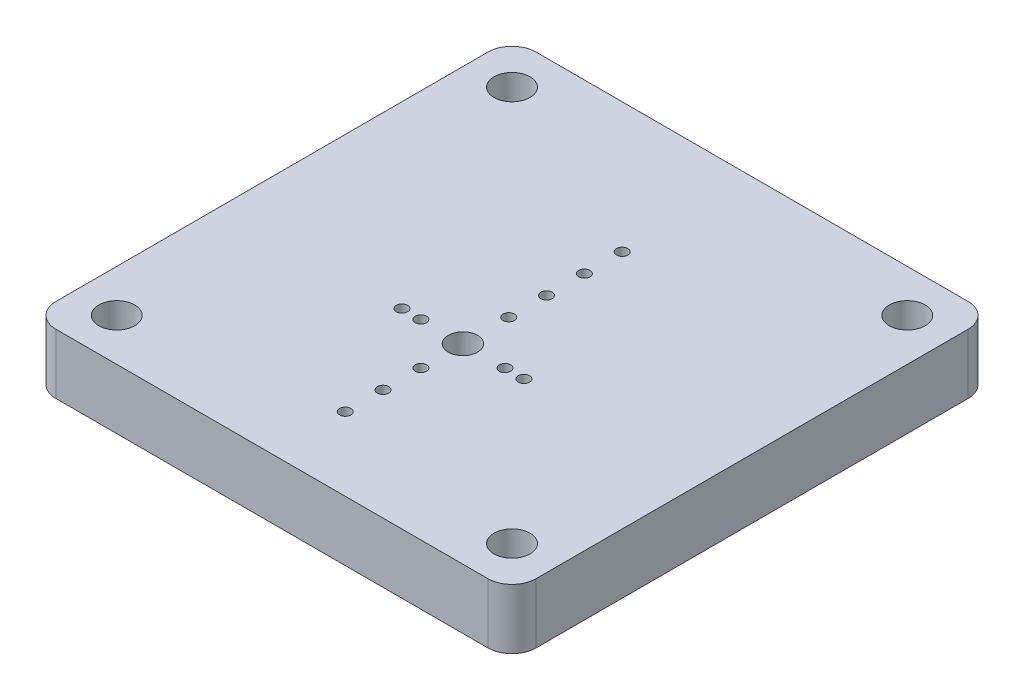
ISO-10303-21;
HEADER;
FILE_DESCRIPTION(('STEP AP214'),'2;1');
FILE_NAME('part.step','',(''),(''),'','','');
FILE_SCHEMA(('AUTOMOTIVE_DESIGN { 1 0 10303 214 1 1 1 1 }'));
ENDSEC;
DATA;
#1=APPLICATION_CONTEXT('core data for automotive mechanical design processes');
#2=APPLICATION_PROTOCOL_DEFINITION('international standard','automotive_design',2000,#1);
#3=PRODUCT_CONTEXT('',#1,'mechanical');
#4=PRODUCT('Part','Part','',(#3));
#5=PRODUCT_RELATED_PRODUCT_CATEGORY('part','',(#4));
#6=PRODUCT_DEFINITION_FORMATION('','',#4);
#7=PRODUCT_DEFINITION_CONTEXT('part definition',#1,'design');
#8=PRODUCT_DEFINITION('design','',#6,#7);
#9=PRODUCT_DEFINITION_SHAPE('','',#8);
#10=(LENGTH_UNIT() NAMED_UNIT(*) SI_UNIT(.MILLI.,.METRE.));
#11=(NAMED_UNIT(*) PLANE_ANGLE_UNIT() SI_UNIT($,.RADIAN.));
#12=(NAMED_UNIT(*) SI_UNIT($,.STERADIAN.) SOLID_ANGLE_UNIT());
#13=UNCERTAINTY_MEASURE_WITH_UNIT(LENGTH_MEASURE(1.E-05),#10,'distance_accuracy_value','');
#14=(GEOMETRIC_REPRESENTATION_CONTEXT(3) GLOBAL_UNCERTAINTY_ASSIGNED_CONTEXT((#13)) GLOBAL_UNIT_ASSIGNED_CONTEXT((#10,
#11,#12)) REPRESENTATION_CONTEXT('',''));
#15=CARTESIAN_POINT('',(0.,0.,0.));
#16=DIRECTION('',(0.,0.,1.));
#17=DIRECTION('',(1.,0.,0.));
#18=AXIS2_PLACEMENT_3D('',#15,#16,#17);
#19=CARTESIAN_POINT('',(25.404,6.35,-11.752));
#20=DIRECTION('',(0.,-1.,0.));
#21=DIRECTION('',(0.,0.,-1.));
#22=AXIS2_PLACEMENT_3D('',#19,#20,#21);
#23=CYLINDRICAL_SURFACE('',#22,0.600000000000017);
#24=CARTESIAN_POINT('',(25.404,6.35,-11.752));
#25=DIRECTION('',(0.,1.,0.));
#26=DIRECTION('',(0.,0.,1.));
#27=AXIS2_PLACEMENT_3D('',#24,#25,#26);
#28=CIRCLE('',#27,0.600000000000017);
#29=CARTESIAN_POINT('',(25.404,6.35,-11.152));
#30=VERTEX_POINT('',#29);
#31=EDGE_CURVE('E297',#30,#30,#28,.T.);
#32=ORIENTED_EDGE('',*,*,#31,.T.);
#33=EDGE_LOOP('',(#32));
#34=FACE_BOUND('',#33,.T.);
#35=CARTESIAN_POINT('',(25.404,3.175,-11.752));
#36=DIRECTION('',(0.,-1.,0.));
#37=DIRECTION('',(0.,0.,-1.));
#38=AXIS2_PLACEMENT_3D('',#35,#36,#37);
#39=CIRCLE('',#38,0.600000000000017);
#40=CARTESIAN_POINT('',(25.404,3.175,-12.352));
#41=VERTEX_POINT('',#40);
#42=EDGE_CURVE('E256',#41,#41,#39,.T.);
#43=ORIENTED_EDGE('',*,*,#42,.T.);
#44=EDGE_LOOP('',(#43));
#45=FACE_BOUND('',#44,.T.);
#46=ADVANCED_FACE('F41',(#34,#45),#23,.F.);
#47=CARTESIAN_POINT('',(18.954,6.35,-20.202));
#48=DIRECTION('',(0.,-1.,0.));
#49=DIRECTION('',(0.,0.,-1.));
#50=AXIS2_PLACEMENT_3D('',#47,#48,#49);
#51=CYLINDRICAL_SURFACE('',#50,0.600000000000021);
#52=CARTESIAN_POINT('',(18.954,6.35,-20.202));
#53=DIRECTION('',(0.,1.,0.));
#54=DIRECTION('',(0.,0.,1.));
#55=AXIS2_PLACEMENT_3D('',#52,#53,#54);
#56=CIRCLE('',#55,0.600000000000021);
#57=CARTESIAN_POINT('',(18.954,6.35,-19.602));
#58=VERTEX_POINT('',#57);
#59=EDGE_CURVE('E294',#58,#58,#56,.T.);
#60=ORIENTED_EDGE('',*,*,#59,.T.);
#61=EDGE_LOOP('',(#60));
#62=FACE_BOUND('',#61,.T.);
#63=CARTESIAN_POINT('',(18.954,3.175,-20.202));
#64=DIRECTION('',(0.,-1.,0.));
#65=DIRECTION('',(0.,0.,-1.));
#66=AXIS2_PLACEMENT_3D('',#63,#64,#65);
#67=CIRCLE('',#66,0.600000000000021);
#68=CARTESIAN_POINT('',(18.954,3.175,-20.802));
#69=VERTEX_POINT('',#68);
#70=EDGE_CURVE('E253',#69,#69,#67,.T.);
#71=ORIENTED_EDGE('',*,*,#70,.T.);
#72=EDGE_LOOP('',(#71));
#73=FACE_BOUND('',#72,.T.);
#74=ADVANCED_FACE('F418',(#62,#73),#51,.F.);
#75=CARTESIAN_POINT('',(20.954,6.35,-20.202));
#76=DIRECTION('',(0.,-1.,0.));
#77=DIRECTION('',(0.,0.,-1.));
#78=AXIS2_PLACEMENT_3D('',#75,#76,#77);
#79=CYLINDRICAL_SURFACE('',#78,0.600000000000017);
#80=CARTESIAN_POINT('',(20.954,6.35,-20.202));
#81=DIRECTION('',(0.,1.,0.));
#82=DIRECTION('',(0.,0.,1.));
#83=AXIS2_PLACEMENT_3D('',#80,#81,#82);
#84=CIRCLE('',#83,0.600000000000017);
#85=CARTESIAN_POINT('',(20.954,6.35,-19.602));
#86=VERTEX_POINT('',#85);
#87=EDGE_CURVE('E291',#86,#86,#84,.T.);
#88=ORIENTED_EDGE('',*,*,#87,.T.);
#89=EDGE_LOOP('',(#88));
#90=FACE_BOUND('',#89,.T.);
#91=CARTESIAN_POINT('',(20.954,3.175,-20.202));
#92=DIRECTION('',(0.,-1.,0.));
#93=DIRECTION('',(0.,0.,-1.));
#94=AXIS2_PLACEMENT_3D('',#91,#92,#93);
#95=CIRCLE('',#94,0.600000000000017);
#96=CARTESIAN_POINT('',(20.954,3.175,-20.802));
#97=VERTEX_POINT('',#96);
#98=EDGE_CURVE('E250',#97,#97,#95,.T.);
#99=ORIENTED_EDGE('',*,*,#98,.T.);
#100=EDGE_LOOP('',(#99));
#101=FACE_BOUND('',#100,.T.);
#102=ADVANCED_FACE('F424',(#90,#101),#79,.F.);
#103=CARTESIAN_POINT('',(31.854,6.35,-20.202));
#104=DIRECTION('',(0.,-1.,0.));
#105=DIRECTION('',(0.,0.,-1.));
#106=AXIS2_PLACEMENT_3D('',#103,#104,#105);
#107=CYLINDRICAL_SURFACE('',#106,0.60000000000001);
#108=CARTESIAN_POINT('',(31.854,6.35,-20.202));
#109=DIRECTION('',(0.,1.,0.));
#110=DIRECTION('',(0.,0.,1.));
#111=AXIS2_PLACEMENT_3D('',#108,#109,#110);
#112=CIRCLE('',#111,0.60000000000001);
#113=CARTESIAN_POINT('',(31.854,6.35,-19.602));
#114=VERTEX_POINT('',#113);
#115=EDGE_CURVE('E288',#114,#114,#112,.T.);
#116=ORIENTED_EDGE('',*,*,#115,.T.);
#117=EDGE_LOOP('',(#116));
#118=FACE_BOUND('',#117,.T.);
#119=CARTESIAN_POINT('',(31.854,3.175,-20.202));
#120=DIRECTION('',(0.,-1.,0.));
#121=DIRECTION('',(0.,0.,-1.));
#122=AXIS2_PLACEMENT_3D('',#119,#120,#121);
#123=CIRCLE('',#122,0.60000000000001);
#124=CARTESIAN_POINT('',(31.854,3.175,-20.802));
#125=VERTEX_POINT('',#124);
#126=EDGE_CURVE('E247',#125,#125,#123,.T.);
#127=ORIENTED_EDGE('',*,*,#126,.T.);
#128=EDGE_LOOP('',(#127));
#129=FACE_BOUND('',#128,.T.);
#130=ADVANCED_FACE('F434',(#118,#129),#107,.F.);
#131=CARTESIAN_POINT('',(29.854,6.35,-20.202));
#132=DIRECTION('',(0.,-1.,0.));
#133=DIRECTION('',(0.,0.,-1.));
#134=AXIS2_PLACEMENT_3D('',#131,#132,#133);
#135=CYLINDRICAL_SURFACE('',#134,0.600000000000017);
#136=CARTESIAN_POINT('',(29.854,6.35,-20.202));
#137=DIRECTION('',(0.,1.,0.));
#138=DIRECTION('',(0.,0.,1.));
#139=AXIS2_PLACEMENT_3D('',#136,#137,#138);
#140=CIRCLE('',#139,0.600000000000017);
#141=CARTESIAN_POINT('',(29.854,6.35,-19.602));
#142=VERTEX_POINT('',#141);
#143=EDGE_CURVE('E285',#142,#142,#140,.T.);
#144=ORIENTED_EDGE('',*,*,#143,.T.);
#145=EDGE_LOOP('',(#144));
#146=FACE_BOUND('',#145,.T.);
#147=CARTESIAN_POINT('',(29.854,3.175,-20.202));
#148=DIRECTION('',(0.,-1.,0.));
#149=DIRECTION('',(0.,0.,-1.));
#150=AXIS2_PLACEMENT_3D('',#147,#148,#149);
#151=CIRCLE('',#150,0.600000000000017);
#152=CARTESIAN_POINT('',(29.854,3.175,-20.802));
#153=VERTEX_POINT('',#152);
#154=EDGE_CURVE('E244',#153,#153,#151,.T.);
#155=ORIENTED_EDGE('',*,*,#154,.T.);
#156=EDGE_LOOP('',(#155));
#157=FACE_BOUND('',#156,.T.);
#158=ADVANCED_FACE('F438',(#146,#157),#135,.F.);
#159=CARTESIAN_POINT('',(25.404,6.35,-37.052));
#160=DIRECTION('',(0.,-1.,0.));
#161=DIRECTION('',(0.,0.,-1.));
#162=AXIS2_PLACEMENT_3D('',#159,#160,#161);
#163=CYLINDRICAL_SURFACE('',#162,0.600000000000017);
#164=CARTESIAN_POINT('',(25.404,6.35,-37.052));
#165=DIRECTION('',(0.,1.,0.));
#166=DIRECTION('',(0.,0.,1.));
#167=AXIS2_PLACEMENT_3D('',#164,#165,#166);
#168=CIRCLE('',#167,0.600000000000017);
#169=CARTESIAN_POINT('',(25.404,6.35,-36.452));
#170=VERTEX_POINT('',#169);
#171=EDGE_CURVE('E282',#170,#170,#168,.T.);
#172=ORIENTED_EDGE('',*,*,#171,.T.);
#173=EDGE_LOOP('',(#172));
#174=FACE_BOUND('',#173,.T.);
#175=CARTESIAN_POINT('',(25.404,3.175,-37.052));
#176=DIRECTION('',(0.,-1.,0.));
#177=DIRECTION('',(0.,0.,-1.));
#178=AXIS2_PLACEMENT_3D('',#175,#176,#177);
#179=CIRCLE('',#178,0.600000000000017);
#180=CARTESIAN_POINT('',(25.404,3.175,-37.652));
#181=VERTEX_POINT('',#180);
#182=EDGE_CURVE('E241',#181,#181,#179,.T.);
#183=ORIENTED_EDGE('',*,*,#182,.T.);
#184=EDGE_LOOP('',(#183));
#185=FACE_BOUND('',#184,.T.);
#186=ADVANCED_FACE('F442',(#174,#185),#163,.F.);
#187=CARTESIAN_POINT('',(25.404,6.35,-33.052));
#188=DIRECTION('',(0.,-1.,0.));
#189=DIRECTION('',(0.,0.,-1.));
#190=AXIS2_PLACEMENT_3D('',#187,#188,#189);
#191=CYLINDRICAL_SURFACE('',#190,0.600000000000017);
#192=CARTESIAN_POINT('',(25.404,6.35,-33.052));
#193=DIRECTION('',(0.,1.,0.));
#194=DIRECTION('',(0.,0.,1.));
#195=AXIS2_PLACEMENT_3D('',#192,#193,#194);
#196=CIRCLE('',#195,0.600000000000017);
#197=CARTESIAN_POINT('',(25.404,6.35,-32.452));
#198=VERTEX_POINT('',#197);
#199=EDGE_CURVE('E279',#198,#198,#196,.T.);
#200=ORIENTED_EDGE('',*,*,#199,.T.);
#201=EDGE_LOOP('',(#200));
#202=FACE_BOUND('',#201,.T.);
#203=CARTESIAN_POINT('',(25.404,3.175,-33.052));
#204=DIRECTION('',(0.,-1.,0.));
#205=DIRECTION('',(0.,0.,-1.));
#206=AXIS2_PLACEMENT_3D('',#203,#204,#205);
#207=CIRCLE('',#206,0.600000000000017);
#208=CARTESIAN_POINT('',(25.404,3.175,-33.652));
#209=VERTEX_POINT('',#208);
#210=EDGE_CURVE('E238',#209,#209,#207,.T.);
#211=ORIENTED_EDGE('',*,*,#210,.T.);
#212=EDGE_LOOP('',(#211));
#213=FACE_BOUND('',#212,.T.);
#214=ADVANCED_FACE('F446',(#202,#213),#191,.F.);
#215=CARTESIAN_POINT('',(25.404,6.35,-29.052));
#216=DIRECTION('',(0.,-1.,0.));
#217=DIRECTION('',(0.,0.,-1.));
#218=AXIS2_PLACEMENT_3D('',#215,#216,#217);
#219=CYLINDRICAL_SURFACE('',#218,0.600000000000017);
#220=CARTESIAN_POINT('',(25.404,6.35,-29.052));
#221=DIRECTION('',(0.,1.,0.));
#222=DIRECTION('',(0.,0.,1.));
#223=AXIS2_PLACEMENT_3D('',#220,#221,#222);
#224=CIRCLE('',#223,0.600000000000017);
#225=CARTESIAN_POINT('',(25.404,6.35,-28.452));
#226=VERTEX_POINT('',#225);
#227=EDGE_CURVE('E276',#226,#226,#224,.T.);
#228=ORIENTED_EDGE('',*,*,#227,.T.);
#229=EDGE_LOOP('',(#228));
#230=FACE_BOUND('',#229,.T.);
#231=CARTESIAN_POINT('',(25.404,3.175,-29.052));
#232=DIRECTION('',(0.,-1.,0.));
#233=DIRECTION('',(0.,0.,-1.));
#234=AXIS2_PLACEMENT_3D('',#231,#232,#233);
#235=CIRCLE('',#234,0.600000000000017);
#236=CARTESIAN_POINT('',(25.404,3.175,-29.652));
#237=VERTEX_POINT('',#236);
#238=EDGE_CURVE('E235',#237,#237,#235,.T.);
#239=ORIENTED_EDGE('',*,*,#238,.T.);
#240=EDGE_LOOP('',(#239));
#241=FACE_BOUND('',#240,.T.);
#242=ADVANCED_FACE('F450',(#230,#241),#219,.F.);
#243=CARTESIAN_POINT('',(25.404,6.35,-25.052));
#244=DIRECTION('',(0.,-1.,0.));
#245=DIRECTION('',(0.,0.,-1.));
#246=AXIS2_PLACEMENT_3D('',#243,#244,#245);
#247=CYLINDRICAL_SURFACE('',#246,0.600000000000014);
#248=CARTESIAN_POINT('',(25.404,6.35,-25.052));
#249=DIRECTION('',(0.,1.,0.));
#250=DIRECTION('',(0.,0.,1.));
#251=AXIS2_PLACEMENT_3D('',#248,#249,#250);
#252=CIRCLE('',#251,0.600000000000014);
#253=CARTESIAN_POINT('',(25.404,6.35,-24.452));
#254=VERTEX_POINT('',#253);
#255=EDGE_CURVE('E273',#254,#254,#252,.T.);
#256=ORIENTED_EDGE('',*,*,#255,.T.);
#257=EDGE_LOOP('',(#256));
#258=FACE_BOUND('',#257,.T.);
#259=CARTESIAN_POINT('',(25.404,3.175,-25.052));
#260=DIRECTION('',(0.,-1.,0.));
#261=DIRECTION('',(0.,0.,-1.));
#262=AXIS2_PLACEMENT_3D('',#259,#260,#261);
#263=CIRCLE('',#262,0.600000000000014);
#264=CARTESIAN_POINT('',(25.404,3.175,-25.652));
#265=VERTEX_POINT('',#264);
#266=EDGE_CURVE('E232',#265,#265,#263,.T.);
#267=ORIENTED_EDGE('',*,*,#266,.T.);
#268=EDGE_LOOP('',(#267));
#269=FACE_BOUND('',#268,.T.);
#270=ADVANCED_FACE('F454',(#258,#269),#247,.F.);
#271=CARTESIAN_POINT('',(25.404,6.35,-7.75200000000002));
#272=DIRECTION('',(0.,-1.,0.));
#273=DIRECTION('',(0.,0.,-1.));
#274=AXIS2_PLACEMENT_3D('',#271,#272,#273);
#275=CYLINDRICAL_SURFACE('',#274,0.600000000000017);
#276=CARTESIAN_POINT('',(25.404,6.35,-7.75200000000002));
#277=DIRECTION('',(0.,1.,0.));
#278=DIRECTION('',(0.,0.,1.));
#279=AXIS2_PLACEMENT_3D('',#276,#277,#278);
#280=CIRCLE('',#279,0.600000000000017);
#281=CARTESIAN_POINT('',(25.404,6.35,-7.152));
#282=VERTEX_POINT('',#281);
#283=EDGE_CURVE('E270',#282,#282,#280,.T.);
#284=ORIENTED_EDGE('',*,*,#283,.T.);
#285=EDGE_LOOP('',(#284));
#286=FACE_BOUND('',#285,.T.);
#287=CARTESIAN_POINT('',(25.404,3.175,-7.75200000000002));
#288=DIRECTION('',(0.,-1.,0.));
#289=DIRECTION('',(0.,0.,-1.));
#290=AXIS2_PLACEMENT_3D('',#287,#288,#289);
#291=CIRCLE('',#290,0.600000000000017);
#292=CARTESIAN_POINT('',(25.404,3.175,-8.35200000000004));
#293=VERTEX_POINT('',#292);
#294=EDGE_CURVE('E229',#293,#293,#291,.T.);
#295=ORIENTED_EDGE('',*,*,#294,.T.);
#296=EDGE_LOOP('',(#295));
#297=FACE_BOUND('',#296,.T.);
#298=ADVANCED_FACE('F458',(#286,#297),#275,.F.);
#299=CARTESIAN_POINT('',(25.404,6.35,-15.752));
#300=DIRECTION('',(0.,-1.,0.));
#301=DIRECTION('',(0.,0.,-1.));
#302=AXIS2_PLACEMENT_3D('',#299,#300,#301);
#303=CYLINDRICAL_SURFACE('',#302,0.600000000000017);
#304=CARTESIAN_POINT('',(25.404,6.35,-15.752));
#305=DIRECTION('',(0.,1.,0.));
#306=DIRECTION('',(0.,0.,1.));
#307=AXIS2_PLACEMENT_3D('',#304,#305,#306);
#308=CIRCLE('',#307,0.600000000000017);
#309=CARTESIAN_POINT('',(25.404,6.35,-15.152));
#310=VERTEX_POINT('',#309);
#311=EDGE_CURVE('E267',#310,#310,#308,.T.);
#312=ORIENTED_EDGE('',*,*,#311,.T.);
#313=EDGE_LOOP('',(#312));
#314=FACE_BOUND('',#313,.T.);
#315=CARTESIAN_POINT('',(25.404,3.175,-15.752));
#316=DIRECTION('',(0.,-1.,0.));
#317=DIRECTION('',(0.,0.,-1.));
#318=AXIS2_PLACEMENT_3D('',#315,#316,#317);
#319=CIRCLE('',#318,0.600000000000017);
#320=CARTESIAN_POINT('',(25.404,3.175,-16.352));
#321=VERTEX_POINT('',#320);
#322=EDGE_CURVE('E226',#321,#321,#319,.T.);
#323=ORIENTED_EDGE('',*,*,#322,.T.);
#324=EDGE_LOOP('',(#323));
#325=FACE_BOUND('',#324,.T.);
#326=ADVANCED_FACE('F462',(#314,#325),#303,.F.);
#327=CARTESIAN_POINT('',(25.404,6.35,-20.202));
#328=DIRECTION('',(0.,-1.,0.));
#329=DIRECTION('',(0.,0.,-1.));
#330=AXIS2_PLACEMENT_3D('',#327,#328,#329);
#331=CYLINDRICAL_SURFACE('',#330,1.55);
#332=CARTESIAN_POINT('',(25.404,6.35,-20.202));
#333=DIRECTION('',(0.,1.,0.));
#334=DIRECTION('',(0.,0.,1.));
#335=AXIS2_PLACEMENT_3D('',#332,#333,#334);
#336=CIRCLE('',#335,1.55);
#337=CARTESIAN_POINT('',(25.404,6.35,-18.652));
#338=VERTEX_POINT('',#337);
#339=EDGE_CURVE('E263',#338,#338,#336,.T.);
#340=ORIENTED_EDGE('',*,*,#339,.T.);
#341=EDGE_LOOP('',(#340));
#342=FACE_BOUND('',#341,.T.);
#343=CARTESIAN_POINT('',(25.404,3.175,-20.202));
#344=DIRECTION('',(0.,-1.,0.));
#345=DIRECTION('',(0.,0.,-1.));
#346=AXIS2_PLACEMENT_3D('',#343,#344,#345);
#347=CIRCLE('',#346,1.55);
#348=CARTESIAN_POINT('',(25.404,3.175,-21.752));
#349=VERTEX_POINT('',#348);
#350=EDGE_CURVE('E45',#349,#349,#347,.T.);
#351=ORIENTED_EDGE('',*,*,#350,.T.);
#352=EDGE_LOOP('',(#351));
#353=FACE_BOUND('',#352,.T.);
#354=ADVANCED_FACE('F466',(#342,#353),#331,.F.);
#355=CARTESIAN_POINT('',(0.,6.35,-50.8));
#356=DIRECTION('',(0.,0.,-1.));
#357=DIRECTION('',(-1.,0.,0.));
#358=AXIS2_PLACEMENT_3D('',#355,#356,#357);
#359=PLANE('',#358);
#360=DIRECTION('',(1.,0.,0.));
#361=VECTOR('',#360,1.);
#362=CARTESIAN_POINT('',(0.,6.35,-50.8));
#363=LINE('',#362,#361);
#364=CARTESIAN_POINT('',(2.54,6.35,-50.8));
#365=VERTEX_POINT('',#364);
#366=CARTESIAN_POINT('',(48.26,6.35,-50.8));
#367=VERTEX_POINT('',#366);
#368=EDGE_CURVE('E303',#365,#367,#363,.T.);
#369=ORIENTED_EDGE('',*,*,#368,.T.);
#370=DIRECTION('',(0.,-1.,0.));
#371=VECTOR('',#370,1.);
#372=CARTESIAN_POINT('',(48.26,0.,-50.8));
#373=LINE('',#372,#371);
#374=CARTESIAN_POINT('',(48.26,0.,-50.8));
#375=VERTEX_POINT('',#374);
#376=EDGE_CURVE('E343',#367,#375,#373,.T.);
#377=ORIENTED_EDGE('',*,*,#376,.T.);
#378=DIRECTION('',(1.,0.,0.));
#379=VECTOR('',#378,1.);
#380=CARTESIAN_POINT('',(0.,0.,-50.8));
#381=LINE('',#380,#379);
#382=CARTESIAN_POINT('',(2.54,0.,-50.8));
#383=VERTEX_POINT('',#382);
#384=EDGE_CURVE('E326',#383,#375,#381,.T.);
#385=ORIENTED_EDGE('',*,*,#384,.F.);
#386=DIRECTION('',(0.,-1.,0.));
#387=VECTOR('',#386,1.);
#388=CARTESIAN_POINT('',(2.54,6.35,-50.8));
#389=LINE('',#388,#387);
#390=EDGE_CURVE('E320',#383,#365,#389,.F.);
#391=ORIENTED_EDGE('',*,*,#390,.T.);
#392=EDGE_LOOP('',(#369,#377,#385,#391));
#393=FACE_BOUND('',#392,.T.);
#394=ADVANCED_FACE('F407',(#393),#359,.T.);
#395=CARTESIAN_POINT('',(0.,6.35,0.));
#396=DIRECTION('',(-1.,0.,0.));
#397=DIRECTION('',(0.,0.,1.));
#398=AXIS2_PLACEMENT_3D('',#395,#396,#397);
#399=PLANE('',#398);
#400=DIRECTION('',(0.,0.,-1.));
#401=VECTOR('',#400,1.);
#402=CARTESIAN_POINT('',(0.,0.,0.));
#403=LINE('',#402,#401);
#404=CARTESIAN_POINT('',(0.,0.,-2.54));
#405=VERTEX_POINT('',#404);
#406=CARTESIAN_POINT('',(0.,0.,-48.26));
#407=VERTEX_POINT('',#406);
#408=EDGE_CURVE('E329',#405,#407,#403,.T.);
#409=ORIENTED_EDGE('',*,*,#408,.F.);
#410=DIRECTION('',(0.,-1.,0.));
#411=VECTOR('',#410,1.);
#412=CARTESIAN_POINT('',(0.,6.35,-2.54));
#413=LINE('',#412,#411);
#414=CARTESIAN_POINT('',(0.,6.35,-2.54));
#415=VERTEX_POINT('',#414);
#416=EDGE_CURVE('E11',#405,#415,#413,.F.);
#417=ORIENTED_EDGE('',*,*,#416,.T.);
#418=DIRECTION('',(0.,0.,-1.));
#419=VECTOR('',#418,1.);
#420=CARTESIAN_POINT('',(0.,6.35,0.));
#421=LINE('',#420,#419);
#422=CARTESIAN_POINT('',(0.,6.35,-48.26));
#423=VERTEX_POINT('',#422);
#424=EDGE_CURVE('E306',#415,#423,#421,.T.);
#425=ORIENTED_EDGE('',*,*,#424,.T.);
#426=DIRECTION('',(0.,-1.,0.));
#427=VECTOR('',#426,1.);
#428=CARTESIAN_POINT('',(0.,6.35,-48.26));
#429=LINE('',#428,#427);
#430=EDGE_CURVE('E50',#423,#407,#429,.T.);
#431=ORIENTED_EDGE('',*,*,#430,.T.);
#432=EDGE_LOOP('',(#409,#417,#425,#431));
#433=FACE_BOUND('',#432,.T.);
#434=ADVANCED_FACE('F375',(#433),#399,.T.);
#435=CARTESIAN_POINT('',(0.,6.35,0.));
#436=DIRECTION('',(0.,0.,-1.));
#437=DIRECTION('',(-1.,0.,0.));
#438=AXIS2_PLACEMENT_3D('',#435,#436,#437);
#439=PLANE('',#438);
#440=DIRECTION('',(1.,0.,0.));
#441=VECTOR('',#440,1.);
#442=CARTESIAN_POINT('',(0.,0.,0.));
#443=LINE('',#442,#441);
#444=CARTESIAN_POINT('',(2.54,0.,0.));
#445=VERTEX_POINT('',#444);
#446=CARTESIAN_POINT('',(48.26,0.,0.));
#447=VERTEX_POINT('',#446);
#448=EDGE_CURVE('E332',#445,#447,#443,.T.);
#449=ORIENTED_EDGE('',*,*,#448,.T.);
#450=DIRECTION('',(0.,-1.,0.));
#451=VECTOR('',#450,1.);
#452=CARTESIAN_POINT('',(48.26,6.35,0.));
#453=LINE('',#452,#451);
#454=CARTESIAN_POINT('',(48.26,6.35,0.));
#455=VERTEX_POINT('',#454);
#456=EDGE_CURVE('E65',#447,#455,#453,.F.);
#457=ORIENTED_EDGE('',*,*,#456,.T.);
#458=DIRECTION('',(1.,0.,0.));
#459=VECTOR('',#458,1.);
#460=CARTESIAN_POINT('',(0.,6.35,0.));
#461=LINE('',#460,#459);
#462=CARTESIAN_POINT('',(2.54,6.35,0.));
#463=VERTEX_POINT('',#462);
#464=EDGE_CURVE('E309',#463,#455,#461,.T.);
#465=ORIENTED_EDGE('',*,*,#464,.F.);
#466=DIRECTION('',(0.,-1.,0.));
#467=VECTOR('',#466,1.);
#468=CARTESIAN_POINT('',(2.54,0.,0.));
#469=LINE('',#468,#467);
#470=EDGE_CURVE('E367',#463,#445,#469,.T.);
#471=ORIENTED_EDGE('',*,*,#470,.T.);
#472=EDGE_LOOP('',(#449,#457,#465,#471));
#473=FACE_BOUND('',#472,.T.);
#474=ADVANCED_FACE('F389',(#473),#439,.F.);
#475=CARTESIAN_POINT('',(46.3098719394654,6.35,-4.49012806053457));
#476=DIRECTION('',(0.,-1.,0.));
#477=DIRECTION('',(0.,0.,-1.));
#478=AXIS2_PLACEMENT_3D('',#475,#476,#477);
#479=CYLINDRICAL_SURFACE('',#478,1.905);
#480=CARTESIAN_POINT('',(46.3098719394654,6.35,-4.49012806053457));
#481=DIRECTION('',(0.,1.,0.));
#482=DIRECTION('',(0.,0.,1.));
#483=AXIS2_PLACEMENT_3D('',#480,#481,#482);
#484=CIRCLE('',#483,1.905);
#485=CARTESIAN_POINT('',(46.3098719394654,6.35,-2.58512806053457));
#486=VERTEX_POINT('',#485);
#487=EDGE_CURVE('E314',#486,#486,#484,.T.);
#488=ORIENTED_EDGE('',*,*,#487,.T.);
#489=EDGE_LOOP('',(#488));
#490=FACE_BOUND('',#489,.T.);
#491=CARTESIAN_POINT('',(46.3098719394654,0.,-4.49012806053457));
#492=DIRECTION('',(0.,1.,0.));
#493=DIRECTION('',(0.,0.,1.));
#494=AXIS2_PLACEMENT_3D('',#491,#492,#493);
#495=CIRCLE('',#494,1.905);
#496=CARTESIAN_POINT('',(46.3098719394654,0.,-2.58512806053457));
#497=VERTEX_POINT('',#496);
#498=EDGE_CURVE('E337',#497,#497,#495,.T.);
#499=ORIENTED_EDGE('',*,*,#498,.F.);
#500=EDGE_LOOP('',(#499));
#501=FACE_BOUND('',#500,.T.);
#502=ADVANCED_FACE('F679',(#490,#501),#479,.F.);
#503=CARTESIAN_POINT('',(50.8,6.35,0.));
#504=DIRECTION('',(-1.,0.,0.));
#505=DIRECTION('',(0.,0.,1.));
#506=AXIS2_PLACEMENT_3D('',#503,#504,#505);
#507=PLANE('',#506);
#508=DIRECTION('',(0.,0.,-1.));
#509=VECTOR('',#508,1.);
#510=CARTESIAN_POINT('',(50.8,0.,0.));
#511=LINE('',#510,#509);
#512=CARTESIAN_POINT('',(50.8,0.,-2.54));
#513=VERTEX_POINT('',#512);
#514=CARTESIAN_POINT('',(50.8,0.,-48.26));
#515=VERTEX_POINT('',#514);
#516=EDGE_CURVE('E334',#513,#515,#511,.T.);
#517=ORIENTED_EDGE('',*,*,#516,.T.);
#518=DIRECTION('',(0.,-1.,0.));
#519=VECTOR('',#518,1.);
#520=CARTESIAN_POINT('',(50.8,6.35,-48.26));
#521=LINE('',#520,#519);
#522=CARTESIAN_POINT('',(50.8,6.35,-48.26));
#523=VERTEX_POINT('',#522);
#524=EDGE_CURVE('E357',#515,#523,#521,.F.);
#525=ORIENTED_EDGE('',*,*,#524,.T.);
#526=DIRECTION('',(0.,0.,-1.));
#527=VECTOR('',#526,1.);
#528=CARTESIAN_POINT('',(50.8,6.35,0.));
#529=LINE('',#528,#527);
#530=CARTESIAN_POINT('',(50.8,6.35,-2.54));
#531=VERTEX_POINT('',#530);
#532=EDGE_CURVE('E311',#531,#523,#529,.T.);
#533=ORIENTED_EDGE('',*,*,#532,.F.);
#534=DIRECTION('',(0.,-1.,0.));
#535=VECTOR('',#534,1.);
#536=CARTESIAN_POINT('',(50.8,6.35,-2.54));
#537=LINE('',#536,#535);
#538=EDGE_CURVE('E354',#531,#513,#537,.T.);
#539=ORIENTED_EDGE('',*,*,#538,.T.);
#540=EDGE_LOOP('',(#517,#525,#533,#539));
#541=FACE_BOUND('',#540,.T.);
#542=ADVANCED_FACE('F400',(#541),#507,.F.);
#543=CARTESIAN_POINT('',(4.49012806053457,6.35,-4.49012806053457));
#544=DIRECTION('',(0.,-1.,0.));
#545=DIRECTION('',(0.,0.,-1.));
#546=AXIS2_PLACEMENT_3D('',#543,#544,#545);
#547=CYLINDRICAL_SURFACE('',#546,1.905);
#548=CARTESIAN_POINT('',(4.49012806053457,0.,-4.49012806053457));
#549=DIRECTION('',(0.,1.,0.));
#550=DIRECTION('',(0.,0.,1.));
#551=AXIS2_PLACEMENT_3D('',#548,#549,#550);
#552=CIRCLE('',#551,1.905);
#553=CARTESIAN_POINT('',(4.49012806053457,0.,-2.58512806053458));
#554=VERTEX_POINT('',#553);
#555=EDGE_CURVE('E323',#554,#554,#552,.F.);
#556=ORIENTED_EDGE('',*,*,#555,.T.);
#557=EDGE_LOOP('',(#556));
#558=FACE_BOUND('',#557,.T.);
#559=CARTESIAN_POINT('',(4.49012806053457,6.35,-4.49012806053457));
#560=DIRECTION('',(0.,1.,0.));
#561=DIRECTION('',(0.,0.,1.));
#562=AXIS2_PLACEMENT_3D('',#559,#560,#561);
#563=CIRCLE('',#562,1.905);
#564=CARTESIAN_POINT('',(4.49012806053457,6.35,-2.58512806053458));
#565=VERTEX_POINT('',#564);
#566=EDGE_CURVE('E300',#565,#565,#563,.F.);
#567=ORIENTED_EDGE('',*,*,#566,.F.);
#568=EDGE_LOOP('',(#567));
#569=FACE_BOUND('',#568,.T.);
#570=ADVANCED_FACE('F429',(#558,#569),#547,.F.);
#571=CARTESIAN_POINT('',(4.49012806053457,6.35,-46.3098719394654));
#572=DIRECTION('',(0.,-1.,0.));
#573=DIRECTION('',(0.,0.,-1.));
#574=AXIS2_PLACEMENT_3D('',#571,#572,#573);
#575=CYLINDRICAL_SURFACE('',#574,1.905);
#576=CARTESIAN_POINT('',(4.49012806053457,6.35,-46.3098719394654));
#577=DIRECTION('',(0.,1.,0.));
#578=DIRECTION('',(0.,0.,1.));
#579=AXIS2_PLACEMENT_3D('',#576,#577,#578);
#580=CIRCLE('',#579,1.905);
#581=CARTESIAN_POINT('',(4.49012806053457,6.35,-44.4048719394654));
#582=VERTEX_POINT('',#581);
#583=EDGE_CURVE('E260',#582,#582,#580,.T.);
#584=ORIENTED_EDGE('',*,*,#583,.T.);
#585=EDGE_LOOP('',(#584));
#586=FACE_BOUND('',#585,.T.);
#587=CARTESIAN_POINT('',(4.49012806053457,0.,-46.3098719394654));
#588=DIRECTION('',(0.,1.,0.));
#589=DIRECTION('',(0.,0.,1.));
#590=AXIS2_PLACEMENT_3D('',#587,#588,#589);
#591=CIRCLE('',#590,1.905);
#592=CARTESIAN_POINT('',(4.49012806053457,0.,-44.4048719394654));
#593=VERTEX_POINT('',#592);
#594=EDGE_CURVE('E259',#593,#593,#591,.T.);
#595=ORIENTED_EDGE('',*,*,#594,.F.);
#596=EDGE_LOOP('',(#595));
#597=FACE_BOUND('',#596,.T.);
#598=ADVANCED_FACE('F471',(#586,#597),#575,.F.);
#599=CARTESIAN_POINT('',(46.3098719394654,6.35,-46.3098719394654));
#600=DIRECTION('',(0.,-1.,0.));
#601=DIRECTION('',(0.,0.,-1.));
#602=AXIS2_PLACEMENT_3D('',#599,#600,#601);
#603=CYLINDRICAL_SURFACE('',#602,1.905);
#604=CARTESIAN_POINT('',(46.3098719394654,6.35,-46.3098719394654));
#605=DIRECTION('',(0.,1.,0.));
#606=DIRECTION('',(0.,0.,1.));
#607=AXIS2_PLACEMENT_3D('',#604,#605,#606);
#608=CIRCLE('',#607,1.905);
#609=CARTESIAN_POINT('',(46.3098719394654,6.35,-44.4048719394654));
#610=VERTEX_POINT('',#609);
#611=EDGE_CURVE('E317',#610,#610,#608,.F.);
#612=ORIENTED_EDGE('',*,*,#611,.F.);
#613=EDGE_LOOP('',(#612));
#614=FACE_BOUND('',#613,.T.);
#615=CARTESIAN_POINT('',(46.3098719394654,0.,-46.3098719394654));
#616=DIRECTION('',(0.,1.,0.));
#617=DIRECTION('',(0.,0.,1.));
#618=AXIS2_PLACEMENT_3D('',#615,#616,#617);
#619=CIRCLE('',#618,1.905);
#620=CARTESIAN_POINT('',(46.3098719394654,0.,-44.4048719394654));
#621=VERTEX_POINT('',#620);
#622=EDGE_CURVE('E264',#621,#621,#619,.F.);
#623=ORIENTED_EDGE('',*,*,#622,.T.);
#624=EDGE_LOOP('',(#623));
#625=FACE_BOUND('',#624,.T.);
#626=ADVANCED_FACE('F474',(#614,#625),#603,.F.);
#627=CARTESIAN_POINT('',(0.,6.35,0.));
#628=DIRECTION('',(0.,1.,0.));
#629=DIRECTION('',(0.,0.,1.));
#630=AXIS2_PLACEMENT_3D('',#627,#628,#629);
#631=PLANE('',#630);
#632=ORIENTED_EDGE('',*,*,#583,.F.);
#633=EDGE_LOOP('',(#632));
#634=FACE_BOUND('',#633,.T.);
#635=ORIENTED_EDGE('',*,*,#339,.F.);
#636=EDGE_LOOP('',(#635));
#637=FACE_BOUND('',#636,.T.);
#638=ORIENTED_EDGE('',*,*,#311,.F.);
#639=EDGE_LOOP('',(#638));
#640=FACE_BOUND('',#639,.T.);
#641=ORIENTED_EDGE('',*,*,#283,.F.);
#642=EDGE_LOOP('',(#641));
#643=FACE_BOUND('',#642,.T.);
#644=ORIENTED_EDGE('',*,*,#255,.F.);
#645=EDGE_LOOP('',(#644));
#646=FACE_BOUND('',#645,.T.);
#647=ORIENTED_EDGE('',*,*,#227,.F.);
#648=EDGE_LOOP('',(#647));
#649=FACE_BOUND('',#648,.T.);
#650=ORIENTED_EDGE('',*,*,#199,.F.);
#651=EDGE_LOOP('',(#650));
#652=FACE_BOUND('',#651,.T.);
#653=ORIENTED_EDGE('',*,*,#171,.F.);
#654=EDGE_LOOP('',(#653));
#655=FACE_BOUND('',#654,.T.);
#656=ORIENTED_EDGE('',*,*,#143,.F.);
#657=EDGE_LOOP('',(#656));
#658=FACE_BOUND('',#657,.T.);
#659=ORIENTED_EDGE('',*,*,#115,.F.);
#660=EDGE_LOOP('',(#659));
#661=FACE_BOUND('',#660,.T.);
#662=ORIENTED_EDGE('',*,*,#87,.F.);
#663=EDGE_LOOP('',(#662));
#664=FACE_BOUND('',#663,.T.);
#665=ORIENTED_EDGE('',*,*,#59,.F.);
#666=EDGE_LOOP('',(#665));
#667=FACE_BOUND('',#666,.T.);
#668=ORIENTED_EDGE('',*,*,#31,.F.);
#669=EDGE_LOOP('',(#668));
#670=FACE_BOUND('',#669,.T.);
#671=ORIENTED_EDGE('',*,*,#566,.T.);
#672=EDGE_LOOP('',(#671));
#673=FACE_BOUND('',#672,.T.);
#674=ORIENTED_EDGE('',*,*,#532,.T.);
#675=CARTESIAN_POINT('',(48.26,6.35,-48.26));
#676=DIRECTION('',(0.,1.,0.));
#677=DIRECTION('',(0.,0.,1.));
#678=AXIS2_PLACEMENT_3D('',#675,#676,#677);
#679=CIRCLE('',#678,2.54);
#680=EDGE_CURVE('E365',#523,#367,#679,.T.);
#681=ORIENTED_EDGE('',*,*,#680,.T.);
#682=ORIENTED_EDGE('',*,*,#368,.F.);
#683=CARTESIAN_POINT('',(2.54,6.35,-48.26));
#684=DIRECTION('',(0.,1.,0.));
#685=DIRECTION('',(0.,0.,1.));
#686=AXIS2_PLACEMENT_3D('',#683,#684,#685);
#687=CIRCLE('',#686,2.54);
#688=EDGE_CURVE('E359',#365,#423,#687,.T.);
#689=ORIENTED_EDGE('',*,*,#688,.T.);
#690=ORIENTED_EDGE('',*,*,#424,.F.);
#691=CARTESIAN_POINT('',(2.54,6.35,-2.54));
#692=DIRECTION('',(0.,1.,0.));
#693=DIRECTION('',(0.,0.,1.));
#694=AXIS2_PLACEMENT_3D('',#691,#692,#693);
#695=CIRCLE('',#694,2.54);
#696=EDGE_CURVE('E361',#415,#463,#695,.T.);
#697=ORIENTED_EDGE('',*,*,#696,.T.);
#698=ORIENTED_EDGE('',*,*,#464,.T.);
#699=CARTESIAN_POINT('',(48.26,6.35,-2.54));
#700=DIRECTION('',(0.,1.,0.));
#701=DIRECTION('',(0.,0.,1.));
#702=AXIS2_PLACEMENT_3D('',#699,#700,#701);
#703=CIRCLE('',#702,2.54);
#704=EDGE_CURVE('E363',#455,#531,#703,.T.);
#705=ORIENTED_EDGE('',*,*,#704,.T.);
#706=EDGE_LOOP('',(#674,#681,#682,#689,#690,#697,#698,#705));
#707=FACE_BOUND('',#706,.T.);
#708=ORIENTED_EDGE('',*,*,#487,.F.);
#709=EDGE_LOOP('',(#708));
#710=FACE_BOUND('',#709,.T.);
#711=ORIENTED_EDGE('',*,*,#611,.T.);
#712=EDGE_LOOP('',(#711));
#713=FACE_BOUND('',#712,.T.);
#714=ADVANCED_FACE('F392',(#634,#637,#640,#643,#646,#649,#652,#655,#658,#661,#664,#667,#670,
#673,#707,#710,#713),#631,.T.);
#715=CARTESIAN_POINT('',(0.,0.,0.));
#716=DIRECTION('',(0.,1.,0.));
#717=DIRECTION('',(0.,0.,1.));
#718=AXIS2_PLACEMENT_3D('',#715,#716,#717);
#719=PLANE('',#718);
#720=DIRECTION('',(0.,0.,-1.));
#721=VECTOR('',#720,1.);
#722=CARTESIAN_POINT('',(4.49012806053457,0.,-40.5948719394654));
#723=LINE('',#722,#721);
#724=CARTESIAN_POINT('',(4.49012806053457,0.,-10.2051280605346));
#725=VERTEX_POINT('',#724);
#726=CARTESIAN_POINT('',(4.49012806053457,0.,-40.5948719394654));
#727=VERTEX_POINT('',#726);
#728=EDGE_CURVE('E197',#725,#727,#723,.T.);
#729=ORIENTED_EDGE('',*,*,#728,.F.);
#730=CARTESIAN_POINT('',(4.49012806053457,0.,-4.49012806053457));
#731=DIRECTION('',(0.,1.,0.));
#732=DIRECTION('',(0.,0.,-1.));
#733=AXIS2_PLACEMENT_3D('',#730,#731,#732);
#734=CIRCLE('',#733,5.715);
#735=CARTESIAN_POINT('',(10.2051280605346,0.,-4.49012806053457));
#736=VERTEX_POINT('',#735);
#737=EDGE_CURVE('E57',#736,#725,#734,.T.);
#738=ORIENTED_EDGE('',*,*,#737,.F.);
#739=DIRECTION('',(-1.,0.,0.));
#740=VECTOR('',#739,1.);
#741=CARTESIAN_POINT('',(10.2051280605346,0.,-4.49012806053457));
#742=LINE('',#741,#740);
#743=CARTESIAN_POINT('',(40.5948719394654,0.,-4.49012806053457));
#744=VERTEX_POINT('',#743);
#745=EDGE_CURVE('E177',#744,#736,#742,.T.);
#746=ORIENTED_EDGE('',*,*,#745,.F.);
#747=CARTESIAN_POINT('',(46.3098719394654,0.,-4.49012806053457));
#748=DIRECTION('',(0.,1.,0.));
#749=DIRECTION('',(0.,0.,-1.));
#750=AXIS2_PLACEMENT_3D('',#747,#748,#749);
#751=CIRCLE('',#750,5.715);
#752=CARTESIAN_POINT('',(46.3098719394654,0.,-10.2051280605346));
#753=VERTEX_POINT('',#752);
#754=EDGE_CURVE('E180',#753,#744,#751,.T.);
#755=ORIENTED_EDGE('',*,*,#754,.F.);
#756=DIRECTION('',(0.,0.,1.));
#757=VECTOR('',#756,1.);
#758=CARTESIAN_POINT('',(46.3098719394654,0.,-10.2051280605346));
#759=LINE('',#758,#757);
#760=CARTESIAN_POINT('',(46.3098719394654,0.,-40.5948719394654));
#761=VERTEX_POINT('',#760);
#762=EDGE_CURVE('E208',#761,#753,#759,.T.);
#763=ORIENTED_EDGE('',*,*,#762,.F.);
#764=CARTESIAN_POINT('',(46.3098719394654,0.,-46.3098719394654));
#765=DIRECTION('',(0.,1.,0.));
#766=DIRECTION('',(0.,0.,-1.));
#767=AXIS2_PLACEMENT_3D('',#764,#765,#766);
#768=CIRCLE('',#767,5.715);
#769=CARTESIAN_POINT('',(40.5948719394654,0.,-46.3098719394654));
#770=VERTEX_POINT('',#769);
#771=EDGE_CURVE('E205',#770,#761,#768,.T.);
#772=ORIENTED_EDGE('',*,*,#771,.F.);
#773=DIRECTION('',(1.,0.,0.));
#774=VECTOR('',#773,1.);
#775=CARTESIAN_POINT('',(40.5948719394654,0.,-46.3098719394654));
#776=LINE('',#775,#774);
#777=CARTESIAN_POINT('',(10.2051280605346,0.,-46.3098719394654));
#778=VERTEX_POINT('',#777);
#779=EDGE_CURVE('E202',#778,#770,#776,.T.);
#780=ORIENTED_EDGE('',*,*,#779,.F.);
#781=CARTESIAN_POINT('',(4.49012806053457,0.,-46.3098719394654));
#782=DIRECTION('',(0.,1.,0.));
#783=DIRECTION('',(0.,0.,-1.));
#784=AXIS2_PLACEMENT_3D('',#781,#782,#783);
#785=CIRCLE('',#784,5.715);
#786=EDGE_CURVE('E199',#727,#778,#785,.T.);
#787=ORIENTED_EDGE('',*,*,#786,.F.);
#788=EDGE_LOOP('',(#729,#738,#746,#755,#763,#772,#780,#787));
#789=FACE_BOUND('',#788,.T.);
#790=ORIENTED_EDGE('',*,*,#594,.T.);
#791=EDGE_LOOP('',(#790));
#792=FACE_BOUND('',#791,.T.);
#793=ORIENTED_EDGE('',*,*,#555,.F.);
#794=EDGE_LOOP('',(#793));
#795=FACE_BOUND('',#794,.T.);
#796=ORIENTED_EDGE('',*,*,#384,.T.);
#797=CARTESIAN_POINT('',(48.26,0.,-48.26));
#798=DIRECTION('',(0.,1.,0.));
#799=DIRECTION('',(0.,0.,1.));
#800=AXIS2_PLACEMENT_3D('',#797,#798,#799);
#801=CIRCLE('',#800,2.54);
#802=EDGE_CURVE('E352',#375,#515,#801,.F.);
#803=ORIENTED_EDGE('',*,*,#802,.T.);
#804=ORIENTED_EDGE('',*,*,#516,.F.);
#805=CARTESIAN_POINT('',(48.26,0.,-2.54));
#806=DIRECTION('',(0.,1.,0.));
#807=DIRECTION('',(0.,0.,1.));
#808=AXIS2_PLACEMENT_3D('',#805,#806,#807);
#809=CIRCLE('',#808,2.54);
#810=EDGE_CURVE('E350',#513,#447,#809,.F.);
#811=ORIENTED_EDGE('',*,*,#810,.T.);
#812=ORIENTED_EDGE('',*,*,#448,.F.);
#813=CARTESIAN_POINT('',(2.54,0.,-2.54));
#814=DIRECTION('',(0.,1.,0.));
#815=DIRECTION('',(0.,0.,1.));
#816=AXIS2_PLACEMENT_3D('',#813,#814,#815);
#817=CIRCLE('',#816,2.54);
#818=EDGE_CURVE('E348',#445,#405,#817,.F.);
#819=ORIENTED_EDGE('',*,*,#818,.T.);
#820=ORIENTED_EDGE('',*,*,#408,.T.);
#821=CARTESIAN_POINT('',(2.54,0.,-48.26));
#822=DIRECTION('',(0.,1.,0.));
#823=DIRECTION('',(0.,0.,1.));
#824=AXIS2_PLACEMENT_3D('',#821,#822,#823);
#825=CIRCLE('',#824,2.54);
#826=EDGE_CURVE('E346',#407,#383,#825,.F.);
#827=ORIENTED_EDGE('',*,*,#826,.T.);
#828=EDGE_LOOP('',(#796,#803,#804,#811,#812,#819,#820,#827));
#829=FACE_BOUND('',#828,.T.);
#830=ORIENTED_EDGE('',*,*,#498,.T.);
#831=EDGE_LOOP('',(#830));
#832=FACE_BOUND('',#831,.T.);
#833=ORIENTED_EDGE('',*,*,#622,.F.);
#834=EDGE_LOOP('',(#833));
#835=FACE_BOUND('',#834,.T.);
#836=ADVANCED_FACE('F381',(#789,#792,#795,#829,#832,#835),#719,.F.);
#837=CARTESIAN_POINT('',(48.26,6.35,-48.26));
#838=DIRECTION('',(0.,1.,0.));
#839=DIRECTION('',(0.,0.,1.));
#840=AXIS2_PLACEMENT_3D('',#837,#838,#839);
#841=CYLINDRICAL_SURFACE('',#840,2.54);
#842=ORIENTED_EDGE('',*,*,#680,.F.);
#843=ORIENTED_EDGE('',*,*,#524,.F.);
#844=ORIENTED_EDGE('',*,*,#802,.F.);
#845=ORIENTED_EDGE('',*,*,#376,.F.);
#846=EDGE_LOOP('',(#842,#843,#844,#845));
#847=FACE_BOUND('',#846,.T.);
#848=ADVANCED_FACE('F405',(#847),#841,.T.);
#849=CARTESIAN_POINT('',(48.26,6.35,-2.54));
#850=DIRECTION('',(0.,-1.,0.));
#851=DIRECTION('',(0.,0.,-1.));
#852=AXIS2_PLACEMENT_3D('',#849,#850,#851);
#853=CYLINDRICAL_SURFACE('',#852,2.54);
#854=ORIENTED_EDGE('',*,*,#704,.F.);
#855=ORIENTED_EDGE('',*,*,#456,.F.);
#856=ORIENTED_EDGE('',*,*,#810,.F.);
#857=ORIENTED_EDGE('',*,*,#538,.F.);
#858=EDGE_LOOP('',(#854,#855,#856,#857));
#859=FACE_BOUND('',#858,.T.);
#860=ADVANCED_FACE('F397',(#859),#853,.T.);
#861=CARTESIAN_POINT('',(2.54,6.35,-2.54));
#862=DIRECTION('',(0.,1.,0.));
#863=DIRECTION('',(0.,0.,1.));
#864=AXIS2_PLACEMENT_3D('',#861,#862,#863);
#865=CYLINDRICAL_SURFACE('',#864,2.54);
#866=ORIENTED_EDGE('',*,*,#696,.F.);
#867=ORIENTED_EDGE('',*,*,#416,.F.);
#868=ORIENTED_EDGE('',*,*,#818,.F.);
#869=ORIENTED_EDGE('',*,*,#470,.F.);
#870=EDGE_LOOP('',(#866,#867,#868,#869));
#871=FACE_BOUND('',#870,.T.);
#872=ADVANCED_FACE('F388',(#871),#865,.T.);
#873=CARTESIAN_POINT('',(2.54,6.35,-48.26));
#874=DIRECTION('',(0.,-1.,0.));
#875=DIRECTION('',(0.,0.,-1.));
#876=AXIS2_PLACEMENT_3D('',#873,#874,#875);
#877=CYLINDRICAL_SURFACE('',#876,2.54);
#878=ORIENTED_EDGE('',*,*,#688,.F.);
#879=ORIENTED_EDGE('',*,*,#390,.F.);
#880=ORIENTED_EDGE('',*,*,#826,.F.);
#881=ORIENTED_EDGE('',*,*,#430,.F.);
#882=EDGE_LOOP('',(#878,#879,#880,#881));
#883=FACE_BOUND('',#882,.T.);
#884=ADVANCED_FACE('F43',(#883),#877,.T.);
#885=CARTESIAN_POINT('',(4.49012806053457,3.175,-4.49012806053457));
#886=DIRECTION('',(0.,-1.,0.));
#887=DIRECTION('',(0.,0.,-1.));
#888=AXIS2_PLACEMENT_3D('',#885,#886,#887);
#889=CYLINDRICAL_SURFACE('',#888,5.715);
#890=ORIENTED_EDGE('',*,*,#737,.T.);
#891=DIRECTION('',(0.,-1.,0.));
#892=VECTOR('',#891,1.);
#893=CARTESIAN_POINT('',(4.49012806053457,3.175,-10.2051280605346));
#894=LINE('',#893,#892);
#895=CARTESIAN_POINT('',(4.49012806053457,3.175,-10.2051280605346));
#896=VERTEX_POINT('',#895);
#897=EDGE_CURVE('E154',#896,#725,#894,.T.);
#898=ORIENTED_EDGE('',*,*,#897,.F.);
#899=CARTESIAN_POINT('',(4.49012806053457,3.175,-4.49012806053457));
#900=DIRECTION('',(0.,1.,0.));
#901=DIRECTION('',(0.,0.,-1.));
#902=AXIS2_PLACEMENT_3D('',#899,#900,#901);
#903=CIRCLE('',#902,5.715);
#904=CARTESIAN_POINT('',(10.2051280605346,3.175,-4.49012806053457));
#905=VERTEX_POINT('',#904);
#906=EDGE_CURVE('E158',#905,#896,#903,.T.);
#907=ORIENTED_EDGE('',*,*,#906,.F.);
#908=DIRECTION('',(0.,-1.,0.));
#909=VECTOR('',#908,1.);
#910=CARTESIAN_POINT('',(10.2051280605346,3.175,-4.49012806053457));
#911=LINE('',#910,#909);
#912=EDGE_CURVE('E213',#905,#736,#911,.T.);
#913=ORIENTED_EDGE('',*,*,#912,.T.);
#914=EDGE_LOOP('',(#890,#898,#907,#913));
#915=FACE_BOUND('',#914,.T.);
#916=ADVANCED_FACE('F156',(#915),#889,.T.);
#917=CARTESIAN_POINT('',(10.2051280605346,3.175,-4.49012806053457));
#918=DIRECTION('',(0.,0.,1.));
#919=DIRECTION('',(1.,0.,0.));
#920=AXIS2_PLACEMENT_3D('',#917,#918,#919);
#921=PLANE('',#920);
#922=ORIENTED_EDGE('',*,*,#745,.T.);
#923=ORIENTED_EDGE('',*,*,#912,.F.);
#924=DIRECTION('',(-1.,0.,0.));
#925=VECTOR('',#924,1.);
#926=CARTESIAN_POINT('',(10.2051280605346,3.175,-4.49012806053457));
#927=LINE('',#926,#925);
#928=CARTESIAN_POINT('',(40.5948719394654,3.175,-4.49012806053457));
#929=VERTEX_POINT('',#928);
#930=EDGE_CURVE('E164',#929,#905,#927,.T.);
#931=ORIENTED_EDGE('',*,*,#930,.F.);
#932=DIRECTION('',(0.,-1.,0.));
#933=VECTOR('',#932,1.);
#934=CARTESIAN_POINT('',(40.5948719394654,3.175,-4.49012806053457));
#935=LINE('',#934,#933);
#936=EDGE_CURVE('E215',#929,#744,#935,.T.);
#937=ORIENTED_EDGE('',*,*,#936,.T.);
#938=EDGE_LOOP('',(#922,#923,#931,#937));
#939=FACE_BOUND('',#938,.T.);
#940=ADVANCED_FACE('F415',(#939),#921,.F.);
#941=CARTESIAN_POINT('',(46.3098719394654,3.175,-4.49012806053457));
#942=DIRECTION('',(0.,-1.,0.));
#943=DIRECTION('',(0.,0.,-1.));
#944=AXIS2_PLACEMENT_3D('',#941,#942,#943);
#945=CYLINDRICAL_SURFACE('',#944,5.715);
#946=ORIENTED_EDGE('',*,*,#754,.T.);
#947=ORIENTED_EDGE('',*,*,#936,.F.);
#948=CARTESIAN_POINT('',(46.3098719394654,3.175,-4.49012806053457));
#949=DIRECTION('',(0.,1.,0.));
#950=DIRECTION('',(0.,0.,-1.));
#951=AXIS2_PLACEMENT_3D('',#948,#949,#950);
#952=CIRCLE('',#951,5.715);
#953=CARTESIAN_POINT('',(46.3098719394654,3.175,-10.2051280605346));
#954=VERTEX_POINT('',#953);
#955=EDGE_CURVE('E193',#954,#929,#952,.T.);
#956=ORIENTED_EDGE('',*,*,#955,.F.);
#957=DIRECTION('',(0.,-1.,0.));
#958=VECTOR('',#957,1.);
#959=CARTESIAN_POINT('',(46.3098719394654,3.175,-10.2051280605346));
#960=LINE('',#959,#958);
#961=EDGE_CURVE('E217',#954,#753,#960,.T.);
#962=ORIENTED_EDGE('',*,*,#961,.T.);
#963=EDGE_LOOP('',(#946,#947,#956,#962));
#964=FACE_BOUND('',#963,.T.);
#965=ADVANCED_FACE('F600',(#964),#945,.T.);
#966=CARTESIAN_POINT('',(46.3098719394654,3.175,-10.2051280605346));
#967=DIRECTION('',(1.,0.,0.));
#968=DIRECTION('',(0.,0.,-1.));
#969=AXIS2_PLACEMENT_3D('',#966,#967,#968);
#970=PLANE('',#969);
#971=ORIENTED_EDGE('',*,*,#762,.T.);
#972=ORIENTED_EDGE('',*,*,#961,.F.);
#973=DIRECTION('',(0.,0.,1.));
#974=VECTOR('',#973,1.);
#975=CARTESIAN_POINT('',(46.3098719394654,3.175,-10.2051280605346));
#976=LINE('',#975,#974);
#977=CARTESIAN_POINT('',(46.3098719394654,3.175,-40.5948719394654));
#978=VERTEX_POINT('',#977);
#979=EDGE_CURVE('E190',#978,#954,#976,.T.);
#980=ORIENTED_EDGE('',*,*,#979,.F.);
#981=DIRECTION('',(0.,-1.,0.));
#982=VECTOR('',#981,1.);
#983=CARTESIAN_POINT('',(46.3098719394654,3.175,-40.5948719394654));
#984=LINE('',#983,#982);
#985=EDGE_CURVE('E219',#978,#761,#984,.T.);
#986=ORIENTED_EDGE('',*,*,#985,.T.);
#987=EDGE_LOOP('',(#971,#972,#980,#986));
#988=FACE_BOUND('',#987,.T.);
#989=ADVANCED_FACE('F610',(#988),#970,.F.);
#990=CARTESIAN_POINT('',(46.3098719394654,3.175,-46.3098719394654));
#991=DIRECTION('',(0.,-1.,0.));
#992=DIRECTION('',(0.,0.,-1.));
#993=AXIS2_PLACEMENT_3D('',#990,#991,#992);
#994=CYLINDRICAL_SURFACE('',#993,5.715);
#995=ORIENTED_EDGE('',*,*,#771,.T.);
#996=ORIENTED_EDGE('',*,*,#985,.F.);
#997=CARTESIAN_POINT('',(46.3098719394654,3.175,-46.3098719394654));
#998=DIRECTION('',(0.,1.,0.));
#999=DIRECTION('',(0.,0.,-1.));
#1000=AXIS2_PLACEMENT_3D('',#997,#998,#999);
#1001=CIRCLE('',#1000,5.715);
#1002=CARTESIAN_POINT('',(40.5948719394654,3.175,-46.3098719394654));
#1003=VERTEX_POINT('',#1002);
#1004=EDGE_CURVE('E187',#1003,#978,#1001,.T.);
#1005=ORIENTED_EDGE('',*,*,#1004,.F.);
#1006=DIRECTION('',(0.,-1.,0.));
#1007=VECTOR('',#1006,1.);
#1008=CARTESIAN_POINT('',(40.5948719394654,3.175,-46.3098719394654));
#1009=LINE('',#1008,#1007);
#1010=EDGE_CURVE('E221',#1003,#770,#1009,.T.);
#1011=ORIENTED_EDGE('',*,*,#1010,.T.);
#1012=EDGE_LOOP('',(#995,#996,#1005,#1011));
#1013=FACE_BOUND('',#1012,.T.);
#1014=ADVANCED_FACE('F620',(#1013),#994,.T.);
#1015=CARTESIAN_POINT('',(40.5948719394654,3.175,-46.3098719394654));
#1016=DIRECTION('',(0.,0.,-1.));
#1017=DIRECTION('',(-1.,0.,0.));
#1018=AXIS2_PLACEMENT_3D('',#1015,#1016,#1017);
#1019=PLANE('',#1018);
#1020=ORIENTED_EDGE('',*,*,#779,.T.);
#1021=ORIENTED_EDGE('',*,*,#1010,.F.);
#1022=DIRECTION('',(1.,0.,0.));
#1023=VECTOR('',#1022,1.);
#1024=CARTESIAN_POINT('',(40.5948719394654,3.175,-46.3098719394654));
#1025=LINE('',#1024,#1023);
#1026=CARTESIAN_POINT('',(10.2051280605346,3.175,-46.3098719394654));
#1027=VERTEX_POINT('',#1026);
#1028=EDGE_CURVE('E184',#1027,#1003,#1025,.T.);
#1029=ORIENTED_EDGE('',*,*,#1028,.F.);
#1030=DIRECTION('',(0.,-1.,0.));
#1031=VECTOR('',#1030,1.);
#1032=CARTESIAN_POINT('',(10.2051280605346,3.175,-46.3098719394654));
#1033=LINE('',#1032,#1031);
#1034=EDGE_CURVE('E223',#1027,#778,#1033,.T.);
#1035=ORIENTED_EDGE('',*,*,#1034,.T.);
#1036=EDGE_LOOP('',(#1020,#1021,#1029,#1035));
#1037=FACE_BOUND('',#1036,.T.);
#1038=ADVANCED_FACE('F630',(#1037),#1019,.F.);
#1039=CARTESIAN_POINT('',(4.49012806053457,3.175,-46.3098719394654));
#1040=DIRECTION('',(0.,-1.,0.));
#1041=DIRECTION('',(0.,0.,-1.));
#1042=AXIS2_PLACEMENT_3D('',#1039,#1040,#1041);
#1043=CYLINDRICAL_SURFACE('',#1042,5.715);
#1044=ORIENTED_EDGE('',*,*,#786,.T.);
#1045=ORIENTED_EDGE('',*,*,#1034,.F.);
#1046=CARTESIAN_POINT('',(4.49012806053457,3.175,-46.3098719394654));
#1047=DIRECTION('',(0.,1.,0.));
#1048=DIRECTION('',(0.,0.,-1.));
#1049=AXIS2_PLACEMENT_3D('',#1046,#1047,#1048);
#1050=CIRCLE('',#1049,5.715);
#1051=CARTESIAN_POINT('',(4.49012806053457,3.175,-40.5948719394654));
#1052=VERTEX_POINT('',#1051);
#1053=EDGE_CURVE('E172',#1052,#1027,#1050,.T.);
#1054=ORIENTED_EDGE('',*,*,#1053,.F.);
#1055=DIRECTION('',(0.,-1.,0.));
#1056=VECTOR('',#1055,1.);
#1057=CARTESIAN_POINT('',(4.49012806053457,3.175,-40.5948719394654));
#1058=LINE('',#1057,#1056);
#1059=EDGE_CURVE('E163',#1052,#727,#1058,.T.);
#1060=ORIENTED_EDGE('',*,*,#1059,.T.);
#1061=EDGE_LOOP('',(#1044,#1045,#1054,#1060));
#1062=FACE_BOUND('',#1061,.T.);
#1063=ADVANCED_FACE('F640',(#1062),#1043,.T.);
#1064=CARTESIAN_POINT('',(4.49012806053457,3.175,-40.5948719394654));
#1065=DIRECTION('',(-1.,0.,0.));
#1066=DIRECTION('',(0.,0.,1.));
#1067=AXIS2_PLACEMENT_3D('',#1064,#1065,#1066);
#1068=PLANE('',#1067);
#1069=ORIENTED_EDGE('',*,*,#728,.T.);
#1070=ORIENTED_EDGE('',*,*,#1059,.F.);
#1071=DIRECTION('',(0.,0.,-1.));
#1072=VECTOR('',#1071,1.);
#1073=CARTESIAN_POINT('',(4.49012806053457,3.175,-40.5948719394654));
#1074=LINE('',#1073,#1072);
#1075=EDGE_CURVE('E167',#896,#1052,#1074,.T.);
#1076=ORIENTED_EDGE('',*,*,#1075,.F.);
#1077=ORIENTED_EDGE('',*,*,#897,.T.);
#1078=EDGE_LOOP('',(#1069,#1070,#1076,#1077));
#1079=FACE_BOUND('',#1078,.T.);
#1080=ADVANCED_FACE('F168',(#1079),#1068,.F.);
#1081=CARTESIAN_POINT('',(4.49012806053457,3.175,-4.49012806053457));
#1082=DIRECTION('',(0.,-1.,0.));
#1083=DIRECTION('',(0.,0.,-1.));
#1084=AXIS2_PLACEMENT_3D('',#1081,#1082,#1083);
#1085=PLANE('',#1084);
#1086=ORIENTED_EDGE('',*,*,#42,.F.);
#1087=EDGE_LOOP('',(#1086));
#1088=FACE_BOUND('',#1087,.T.);
#1089=ORIENTED_EDGE('',*,*,#70,.F.);
#1090=EDGE_LOOP('',(#1089));
#1091=FACE_BOUND('',#1090,.T.);
#1092=ORIENTED_EDGE('',*,*,#98,.F.);
#1093=EDGE_LOOP('',(#1092));
#1094=FACE_BOUND('',#1093,.T.);
#1095=ORIENTED_EDGE('',*,*,#126,.F.);
#1096=EDGE_LOOP('',(#1095));
#1097=FACE_BOUND('',#1096,.T.);
#1098=ORIENTED_EDGE('',*,*,#154,.F.);
#1099=EDGE_LOOP('',(#1098));
#1100=FACE_BOUND('',#1099,.T.);
#1101=ORIENTED_EDGE('',*,*,#182,.F.);
#1102=EDGE_LOOP('',(#1101));
#1103=FACE_BOUND('',#1102,.T.);
#1104=ORIENTED_EDGE('',*,*,#210,.F.);
#1105=EDGE_LOOP('',(#1104));
#1106=FACE_BOUND('',#1105,.T.);
#1107=ORIENTED_EDGE('',*,*,#238,.F.);
#1108=EDGE_LOOP('',(#1107));
#1109=FACE_BOUND('',#1108,.T.);
#1110=ORIENTED_EDGE('',*,*,#266,.F.);
#1111=EDGE_LOOP('',(#1110));
#1112=FACE_BOUND('',#1111,.T.);
#1113=ORIENTED_EDGE('',*,*,#294,.F.);
#1114=EDGE_LOOP('',(#1113));
#1115=FACE_BOUND('',#1114,.T.);
#1116=ORIENTED_EDGE('',*,*,#322,.F.);
#1117=EDGE_LOOP('',(#1116));
#1118=FACE_BOUND('',#1117,.T.);
#1119=ORIENTED_EDGE('',*,*,#350,.F.);
#1120=EDGE_LOOP('',(#1119));
#1121=FACE_BOUND('',#1120,.T.);
#1122=ORIENTED_EDGE('',*,*,#906,.T.);
#1123=ORIENTED_EDGE('',*,*,#1075,.T.);
#1124=ORIENTED_EDGE('',*,*,#1053,.T.);
#1125=ORIENTED_EDGE('',*,*,#1028,.T.);
#1126=ORIENTED_EDGE('',*,*,#1004,.T.);
#1127=ORIENTED_EDGE('',*,*,#979,.T.);
#1128=ORIENTED_EDGE('',*,*,#955,.T.);
#1129=ORIENTED_EDGE('',*,*,#930,.T.);
#1130=EDGE_LOOP('',(#1122,#1123,#1124,#1125,#1126,#1127,#1128,#1129));
#1131=FACE_BOUND('',#1130,.T.);
#1132=ADVANCED_FACE('F174',(#1088,#1091,#1094,#1097,#1100,#1103,#1106,#1109,#1112,#1115,#1118,
#1121,#1131),#1085,.T.);
#1133=CLOSED_SHELL('',(#46,#74,#102,#130,#158,#186,#214,#242,#270,#298,#326,#354,#394,#434,#474,
#502,#542,#570,#598,#626,#714,#836,#848,#860,#872,#884,#916,#940,#965,#989,#1014,#1038,#1063,
#1080,#1132));
#1134=MANIFOLD_SOLID_BREP('B2',#1133);
#1135=ADVANCED_BREP_SHAPE_REPRESENTATION('',(#18,#1134),#14);
#1136=SHAPE_DEFINITION_REPRESENTATION(#9,#1135);
ENDSEC;
END-ISO-10303-21;
